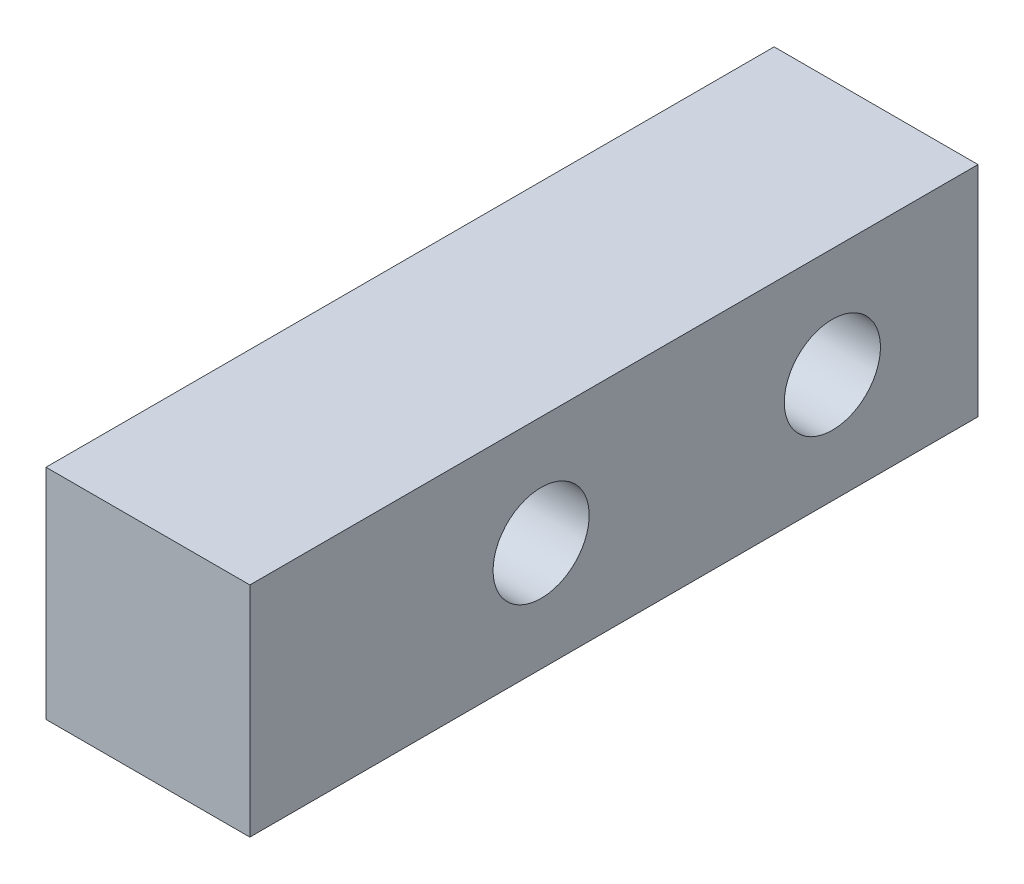
ISO-10303-21;
HEADER;
FILE_DESCRIPTION(('STEP AP214'),'2;1');
FILE_NAME('part.step','',(''),(''),'','','');
FILE_SCHEMA(('AUTOMOTIVE_DESIGN { 1 0 10303 214 1 1 1 1 }'));
ENDSEC;
DATA;
#1=APPLICATION_CONTEXT('core data for automotive mechanical design processes');
#2=APPLICATION_PROTOCOL_DEFINITION('international standard','automotive_design',2000,#1);
#3=PRODUCT_CONTEXT('',#1,'mechanical');
#4=PRODUCT('Part','Part','',(#3));
#5=PRODUCT_RELATED_PRODUCT_CATEGORY('part','',(#4));
#6=PRODUCT_DEFINITION_FORMATION('','',#4);
#7=PRODUCT_DEFINITION_CONTEXT('part definition',#1,'design');
#8=PRODUCT_DEFINITION('design','',#6,#7);
#9=PRODUCT_DEFINITION_SHAPE('','',#8);
#10=(LENGTH_UNIT() NAMED_UNIT(*) SI_UNIT(.MILLI.,.METRE.));
#11=(NAMED_UNIT(*) PLANE_ANGLE_UNIT() SI_UNIT($,.RADIAN.));
#12=(NAMED_UNIT(*) SI_UNIT($,.STERADIAN.) SOLID_ANGLE_UNIT());
#13=UNCERTAINTY_MEASURE_WITH_UNIT(LENGTH_MEASURE(1.E-05),#10,'distance_accuracy_value','');
#14=(GEOMETRIC_REPRESENTATION_CONTEXT(3) GLOBAL_UNCERTAINTY_ASSIGNED_CONTEXT((#13)) GLOBAL_UNIT_ASSIGNED_CONTEXT((#10,
#11,#12)) REPRESENTATION_CONTEXT('',''));
#15=CARTESIAN_POINT('',(0.,0.,0.));
#16=DIRECTION('',(0.,0.,1.));
#17=DIRECTION('',(1.,0.,0.));
#18=AXIS2_PLACEMENT_3D('',#15,#16,#17);
#19=CARTESIAN_POINT('',(-7.,7.5,50.));
#20=DIRECTION('',(1.,0.,0.));
#21=DIRECTION('',(0.,1.,0.));
#22=AXIS2_PLACEMENT_3D('',#19,#20,#21);
#23=PLANE('',#22);
#24=CARTESIAN_POINT('',(-7.,0.,10.));
#25=DIRECTION('',(-1.,0.,0.));
#26=DIRECTION('',(0.,0.,1.));
#27=AXIS2_PLACEMENT_3D('',#24,#25,#26);
#28=CIRCLE('',#27,7.2985);
#29=CARTESIAN_POINT('',(-7.,0.,17.2985));
#30=VERTEX_POINT('',#29);
#31=EDGE_CURVE('E139',#30,#30,#28,.T.);
#32=ORIENTED_EDGE('',*,*,#31,.F.);
#33=EDGE_LOOP('',(#32));
#34=FACE_BOUND('',#33,.T.);
#35=CARTESIAN_POINT('',(-7.,0.,30.));
#36=DIRECTION('',(-1.,0.,0.));
#37=DIRECTION('',(0.,0.,1.));
#38=AXIS2_PLACEMENT_3D('',#35,#36,#37);
#39=CIRCLE('',#38,7.2985);
#40=CARTESIAN_POINT('',(-7.,0.,37.2985));
#41=VERTEX_POINT('',#40);
#42=EDGE_CURVE('E124',#41,#41,#39,.T.);
#43=ORIENTED_EDGE('',*,*,#42,.F.);
#44=EDGE_LOOP('',(#43));
#45=FACE_BOUND('',#44,.T.);
#46=DIRECTION('',(0.,-1.,0.));
#47=VECTOR('',#46,1.);
#48=CARTESIAN_POINT('',(-7.,7.5,0.));
#49=LINE('',#48,#47);
#50=CARTESIAN_POINT('',(-7.,7.5,0.));
#51=VERTEX_POINT('',#50);
#52=CARTESIAN_POINT('',(-7.,-7.5,0.));
#53=VERTEX_POINT('',#52);
#54=EDGE_CURVE('E99',#51,#53,#49,.T.);
#55=ORIENTED_EDGE('',*,*,#54,.T.);
#56=DIRECTION('',(0.,0.,-1.));
#57=VECTOR('',#56,1.);
#58=CARTESIAN_POINT('',(-7.,-7.5,50.));
#59=LINE('',#58,#57);
#60=CARTESIAN_POINT('',(-7.,-7.5,50.));
#61=VERTEX_POINT('',#60);
#62=EDGE_CURVE('E11',#61,#53,#59,.T.);
#63=ORIENTED_EDGE('',*,*,#62,.F.);
#64=DIRECTION('',(0.,-1.,0.));
#65=VECTOR('',#64,1.);
#66=CARTESIAN_POINT('',(-7.,7.5,50.));
#67=LINE('',#66,#65);
#68=CARTESIAN_POINT('',(-7.,7.5,50.));
#69=VERTEX_POINT('',#68);
#70=EDGE_CURVE('E87',#69,#61,#67,.T.);
#71=ORIENTED_EDGE('',*,*,#70,.F.);
#72=DIRECTION('',(0.,0.,-1.));
#73=VECTOR('',#72,1.);
#74=CARTESIAN_POINT('',(-7.,7.5,50.));
#75=LINE('',#74,#73);
#76=EDGE_CURVE('E95',#69,#51,#75,.T.);
#77=ORIENTED_EDGE('',*,*,#76,.T.);
#78=EDGE_LOOP('',(#55,#63,#71,#77));
#79=FACE_BOUND('',#78,.T.);
#80=ADVANCED_FACE('F36',(#34,#45,#79),#23,.F.);
#81=CARTESIAN_POINT('',(7.,-7.5,50.));
#82=DIRECTION('',(0.,1.,0.));
#83=DIRECTION('',(-1.,0.,0.));
#84=AXIS2_PLACEMENT_3D('',#81,#82,#83);
#85=PLANE('',#84);
#86=DIRECTION('',(1.,0.,0.));
#87=VECTOR('',#86,1.);
#88=CARTESIAN_POINT('',(7.,-7.5,0.));
#89=LINE('',#88,#87);
#90=CARTESIAN_POINT('',(7.,-7.5,0.));
#91=VERTEX_POINT('',#90);
#92=EDGE_CURVE('E91',#53,#91,#89,.T.);
#93=ORIENTED_EDGE('',*,*,#92,.T.);
#94=DIRECTION('',(0.,0.,-1.));
#95=VECTOR('',#94,1.);
#96=CARTESIAN_POINT('',(7.,-7.5,50.));
#97=LINE('',#96,#95);
#98=CARTESIAN_POINT('',(7.,-7.5,50.));
#99=VERTEX_POINT('',#98);
#100=EDGE_CURVE('E44',#99,#91,#97,.T.);
#101=ORIENTED_EDGE('',*,*,#100,.F.);
#102=DIRECTION('',(1.,0.,0.));
#103=VECTOR('',#102,1.);
#104=CARTESIAN_POINT('',(7.,-7.5,50.));
#105=LINE('',#104,#103);
#106=EDGE_CURVE('E82',#61,#99,#105,.T.);
#107=ORIENTED_EDGE('',*,*,#106,.F.);
#108=ORIENTED_EDGE('',*,*,#62,.T.);
#109=EDGE_LOOP('',(#93,#101,#107,#108));
#110=FACE_BOUND('',#109,.T.);
#111=ADVANCED_FACE('F90',(#110),#85,.F.);
#112=CARTESIAN_POINT('',(7.,7.5,50.));
#113=DIRECTION('',(-1.,0.,0.));
#114=DIRECTION('',(0.,-1.,0.));
#115=AXIS2_PLACEMENT_3D('',#112,#113,#114);
#116=PLANE('',#115);
#117=CARTESIAN_POINT('',(7.,0.,10.));
#118=DIRECTION('',(-1.,0.,0.));
#119=DIRECTION('',(0.,0.,1.));
#120=AXIS2_PLACEMENT_3D('',#117,#118,#119);
#121=CIRCLE('',#120,3.3);
#122=CARTESIAN_POINT('',(7.,0.,13.3));
#123=VERTEX_POINT('',#122);
#124=EDGE_CURVE('E127',#123,#123,#121,.T.);
#125=ORIENTED_EDGE('',*,*,#124,.T.);
#126=EDGE_LOOP('',(#125));
#127=FACE_BOUND('',#126,.T.);
#128=CARTESIAN_POINT('',(7.,0.,30.));
#129=DIRECTION('',(-1.,0.,0.));
#130=DIRECTION('',(0.,0.,1.));
#131=AXIS2_PLACEMENT_3D('',#128,#129,#130);
#132=CIRCLE('',#131,3.3);
#133=CARTESIAN_POINT('',(7.,0.,33.3));
#134=VERTEX_POINT('',#133);
#135=EDGE_CURVE('E102',#134,#134,#132,.T.);
#136=ORIENTED_EDGE('',*,*,#135,.T.);
#137=EDGE_LOOP('',(#136));
#138=FACE_BOUND('',#137,.T.);
#139=DIRECTION('',(0.,1.,0.));
#140=VECTOR('',#139,1.);
#141=CARTESIAN_POINT('',(7.,7.5,0.));
#142=LINE('',#141,#140);
#143=CARTESIAN_POINT('',(7.,7.5,0.));
#144=VERTEX_POINT('',#143);
#145=EDGE_CURVE('E69',#91,#144,#142,.T.);
#146=ORIENTED_EDGE('',*,*,#145,.T.);
#147=DIRECTION('',(0.,0.,-1.));
#148=VECTOR('',#147,1.);
#149=CARTESIAN_POINT('',(7.,7.5,50.));
#150=LINE('',#149,#148);
#151=CARTESIAN_POINT('',(7.,7.5,50.));
#152=VERTEX_POINT('',#151);
#153=EDGE_CURVE('E92',#152,#144,#150,.T.);
#154=ORIENTED_EDGE('',*,*,#153,.F.);
#155=DIRECTION('',(0.,1.,0.));
#156=VECTOR('',#155,1.);
#157=CARTESIAN_POINT('',(7.,7.5,50.));
#158=LINE('',#157,#156);
#159=EDGE_CURVE('E85',#99,#152,#158,.T.);
#160=ORIENTED_EDGE('',*,*,#159,.F.);
#161=ORIENTED_EDGE('',*,*,#100,.T.);
#162=EDGE_LOOP('',(#146,#154,#160,#161));
#163=FACE_BOUND('',#162,.T.);
#164=ADVANCED_FACE('F93',(#127,#138,#163),#116,.F.);
#165=CARTESIAN_POINT('',(7.,7.5,50.));
#166=DIRECTION('',(0.,-1.,0.));
#167=DIRECTION('',(1.,0.,0.));
#168=AXIS2_PLACEMENT_3D('',#165,#166,#167);
#169=PLANE('',#168);
#170=DIRECTION('',(-1.,0.,0.));
#171=VECTOR('',#170,1.);
#172=CARTESIAN_POINT('',(7.,7.5,0.));
#173=LINE('',#172,#171);
#174=EDGE_CURVE('E75',#144,#51,#173,.T.);
#175=ORIENTED_EDGE('',*,*,#174,.T.);
#176=ORIENTED_EDGE('',*,*,#76,.F.);
#177=DIRECTION('',(-1.,0.,0.));
#178=VECTOR('',#177,1.);
#179=CARTESIAN_POINT('',(7.,7.5,50.));
#180=LINE('',#179,#178);
#181=EDGE_CURVE('E52',#152,#69,#180,.T.);
#182=ORIENTED_EDGE('',*,*,#181,.F.);
#183=ORIENTED_EDGE('',*,*,#153,.T.);
#184=EDGE_LOOP('',(#175,#176,#182,#183));
#185=FACE_BOUND('',#184,.T.);
#186=ADVANCED_FACE('F107',(#185),#169,.F.);
#187=CARTESIAN_POINT('',(0.,0.,50.));
#188=DIRECTION('',(0.,0.,-1.));
#189=DIRECTION('',(-1.,0.,0.));
#190=AXIS2_PLACEMENT_3D('',#187,#188,#189);
#191=PLANE('',#190);
#192=ORIENTED_EDGE('',*,*,#70,.T.);
#193=ORIENTED_EDGE('',*,*,#106,.T.);
#194=ORIENTED_EDGE('',*,*,#159,.T.);
#195=ORIENTED_EDGE('',*,*,#181,.T.);
#196=EDGE_LOOP('',(#192,#193,#194,#195));
#197=FACE_BOUND('',#196,.T.);
#198=ADVANCED_FACE('F83',(#197),#191,.F.);
#199=CARTESIAN_POINT('',(0.,0.,0.));
#200=DIRECTION('',(0.,0.,-1.));
#201=DIRECTION('',(-1.,0.,0.));
#202=AXIS2_PLACEMENT_3D('',#199,#200,#201);
#203=PLANE('',#202);
#204=ORIENTED_EDGE('',*,*,#54,.F.);
#205=ORIENTED_EDGE('',*,*,#174,.F.);
#206=ORIENTED_EDGE('',*,*,#145,.F.);
#207=ORIENTED_EDGE('',*,*,#92,.F.);
#208=EDGE_LOOP('',(#204,#205,#206,#207));
#209=FACE_BOUND('',#208,.T.);
#210=ADVANCED_FACE('F110',(#209),#203,.T.);
#211=CARTESIAN_POINT('',(-7.,0.,30.));
#212=DIRECTION('',(-1.,0.,0.));
#213=DIRECTION('',(0.,0.,1.));
#214=AXIS2_PLACEMENT_3D('',#211,#212,#213);
#215=CYLINDRICAL_SURFACE('',#214,3.3);
#216=ORIENTED_EDGE('',*,*,#135,.F.);
#217=EDGE_LOOP('',(#216));
#218=FACE_BOUND('',#217,.T.);
#219=CARTESIAN_POINT('',(1.,0.,30.));
#220=DIRECTION('',(-1.,0.,0.));
#221=DIRECTION('',(0.,0.,1.));
#222=AXIS2_PLACEMENT_3D('',#219,#220,#221);
#223=CIRCLE('',#222,3.3);
#224=CARTESIAN_POINT('',(1.,0.,33.3));
#225=VERTEX_POINT('',#224);
#226=EDGE_CURVE('E115',#225,#225,#223,.T.);
#227=ORIENTED_EDGE('',*,*,#226,.T.);
#228=EDGE_LOOP('',(#227));
#229=FACE_BOUND('',#228,.T.);
#230=ADVANCED_FACE('F170',(#218,#229),#215,.F.);
#231=CARTESIAN_POINT('',(1.,7.2735,30.));
#232=DIRECTION('',(1.,0.,0.));
#233=DIRECTION('',(0.,0.,-1.));
#234=AXIS2_PLACEMENT_3D('',#231,#232,#233);
#235=PLANE('',#234);
#236=ORIENTED_EDGE('',*,*,#226,.F.);
#237=EDGE_LOOP('',(#236));
#238=FACE_BOUND('',#237,.T.);
#239=CARTESIAN_POINT('',(1.,0.,30.));
#240=DIRECTION('',(-1.,0.,0.));
#241=DIRECTION('',(0.,0.,1.));
#242=AXIS2_PLACEMENT_3D('',#239,#240,#241);
#243=CIRCLE('',#242,7.2735);
#244=CARTESIAN_POINT('',(1.,0.,37.2735));
#245=VERTEX_POINT('',#244);
#246=EDGE_CURVE('E118',#245,#245,#243,.T.);
#247=ORIENTED_EDGE('',*,*,#246,.T.);
#248=EDGE_LOOP('',(#247));
#249=FACE_BOUND('',#248,.T.);
#250=ADVANCED_FACE('F162',(#238,#249),#235,.F.);
#251=CARTESIAN_POINT('',(-7.,0.,30.));
#252=DIRECTION('',(-1.,0.,0.));
#253=DIRECTION('',(0.,0.,1.));
#254=AXIS2_PLACEMENT_3D('',#251,#252,#253);
#255=CYLINDRICAL_SURFACE('',#254,7.2735);
#256=ORIENTED_EDGE('',*,*,#246,.F.);
#257=EDGE_LOOP('',(#256));
#258=FACE_BOUND('',#257,.T.);
#259=CARTESIAN_POINT('',(-6.975,0.,30.));
#260=DIRECTION('',(-1.,0.,0.));
#261=DIRECTION('',(0.,0.,1.));
#262=AXIS2_PLACEMENT_3D('',#259,#260,#261);
#263=CIRCLE('',#262,7.2735);
#264=CARTESIAN_POINT('',(-6.975,0.,37.2735));
#265=VERTEX_POINT('',#264);
#266=EDGE_CURVE('E121',#265,#265,#263,.T.);
#267=ORIENTED_EDGE('',*,*,#266,.T.);
#268=EDGE_LOOP('',(#267));
#269=FACE_BOUND('',#268,.T.);
#270=ADVANCED_FACE('F152',(#258,#269),#255,.F.);
#271=CARTESIAN_POINT('',(-7.,0.,30.));
#272=DIRECTION('',(-1.,0.,0.));
#273=DIRECTION('',(0.,0.,1.));
#274=AXIS2_PLACEMENT_3D('',#271,#272,#273);
#275=CONICAL_SURFACE('',#274,7.2985,0.785398163397379);
#276=ORIENTED_EDGE('',*,*,#266,.F.);
#277=EDGE_LOOP('',(#276));
#278=FACE_BOUND('',#277,.T.);
#279=ORIENTED_EDGE('',*,*,#42,.T.);
#280=EDGE_LOOP('',(#279));
#281=FACE_BOUND('',#280,.T.);
#282=ADVANCED_FACE('F149',(#278,#281),#275,.F.);
#283=CARTESIAN_POINT('',(-7.,0.,10.));
#284=DIRECTION('',(-1.,0.,0.));
#285=DIRECTION('',(0.,0.,1.));
#286=AXIS2_PLACEMENT_3D('',#283,#284,#285);
#287=CYLINDRICAL_SURFACE('',#286,3.3);
#288=ORIENTED_EDGE('',*,*,#124,.F.);
#289=EDGE_LOOP('',(#288));
#290=FACE_BOUND('',#289,.T.);
#291=CARTESIAN_POINT('',(1.,0.,10.));
#292=DIRECTION('',(-1.,0.,0.));
#293=DIRECTION('',(0.,0.,1.));
#294=AXIS2_PLACEMENT_3D('',#291,#292,#293);
#295=CIRCLE('',#294,3.3);
#296=CARTESIAN_POINT('',(1.,0.,13.3));
#297=VERTEX_POINT('',#296);
#298=EDGE_CURVE('E130',#297,#297,#295,.T.);
#299=ORIENTED_EDGE('',*,*,#298,.T.);
#300=EDGE_LOOP('',(#299));
#301=FACE_BOUND('',#300,.T.);
#302=ADVANCED_FACE('F151',(#290,#301),#287,.F.);
#303=CARTESIAN_POINT('',(1.,7.2735,10.));
#304=DIRECTION('',(1.,0.,0.));
#305=DIRECTION('',(0.,0.,-1.));
#306=AXIS2_PLACEMENT_3D('',#303,#304,#305);
#307=PLANE('',#306);
#308=ORIENTED_EDGE('',*,*,#298,.F.);
#309=EDGE_LOOP('',(#308));
#310=FACE_BOUND('',#309,.T.);
#311=CARTESIAN_POINT('',(1.,0.,10.));
#312=DIRECTION('',(-1.,0.,0.));
#313=DIRECTION('',(0.,0.,1.));
#314=AXIS2_PLACEMENT_3D('',#311,#312,#313);
#315=CIRCLE('',#314,7.2735);
#316=CARTESIAN_POINT('',(1.,0.,17.2735));
#317=VERTEX_POINT('',#316);
#318=EDGE_CURVE('E133',#317,#317,#315,.T.);
#319=ORIENTED_EDGE('',*,*,#318,.T.);
#320=EDGE_LOOP('',(#319));
#321=FACE_BOUND('',#320,.T.);
#322=ADVANCED_FACE('F159',(#310,#321),#307,.F.);
#323=CARTESIAN_POINT('',(-7.,0.,10.));
#324=DIRECTION('',(-1.,0.,0.));
#325=DIRECTION('',(0.,0.,1.));
#326=AXIS2_PLACEMENT_3D('',#323,#324,#325);
#327=CYLINDRICAL_SURFACE('',#326,7.2735);
#328=ORIENTED_EDGE('',*,*,#318,.F.);
#329=EDGE_LOOP('',(#328));
#330=FACE_BOUND('',#329,.T.);
#331=CARTESIAN_POINT('',(-6.975,0.,10.));
#332=DIRECTION('',(-1.,0.,0.));
#333=DIRECTION('',(0.,0.,1.));
#334=AXIS2_PLACEMENT_3D('',#331,#332,#333);
#335=CIRCLE('',#334,7.2735);
#336=CARTESIAN_POINT('',(-6.975,0.,17.2735));
#337=VERTEX_POINT('',#336);
#338=EDGE_CURVE('E136',#337,#337,#335,.T.);
#339=ORIENTED_EDGE('',*,*,#338,.T.);
#340=EDGE_LOOP('',(#339));
#341=FACE_BOUND('',#340,.T.);
#342=ADVANCED_FACE('F235',(#330,#341),#327,.F.);
#343=CARTESIAN_POINT('',(-7.,0.,10.));
#344=DIRECTION('',(-1.,0.,0.));
#345=DIRECTION('',(0.,0.,1.));
#346=AXIS2_PLACEMENT_3D('',#343,#344,#345);
#347=CONICAL_SURFACE('',#346,7.2985,0.785398163397379);
#348=ORIENTED_EDGE('',*,*,#338,.F.);
#349=EDGE_LOOP('',(#348));
#350=FACE_BOUND('',#349,.T.);
#351=ORIENTED_EDGE('',*,*,#31,.T.);
#352=EDGE_LOOP('',(#351));
#353=FACE_BOUND('',#352,.T.);
#354=ADVANCED_FACE('F143',(#350,#353),#347,.F.);
#355=CLOSED_SHELL('',(#80,#111,#164,#186,#198,#210,#230,#250,#270,#282,#302,#322,#342,#354));
#356=MANIFOLD_SOLID_BREP('B2',#355);
#357=ADVANCED_BREP_SHAPE_REPRESENTATION('',(#18,#356),#14);
#358=SHAPE_DEFINITION_REPRESENTATION(#9,#357);
ENDSEC;
END-ISO-10303-21;
